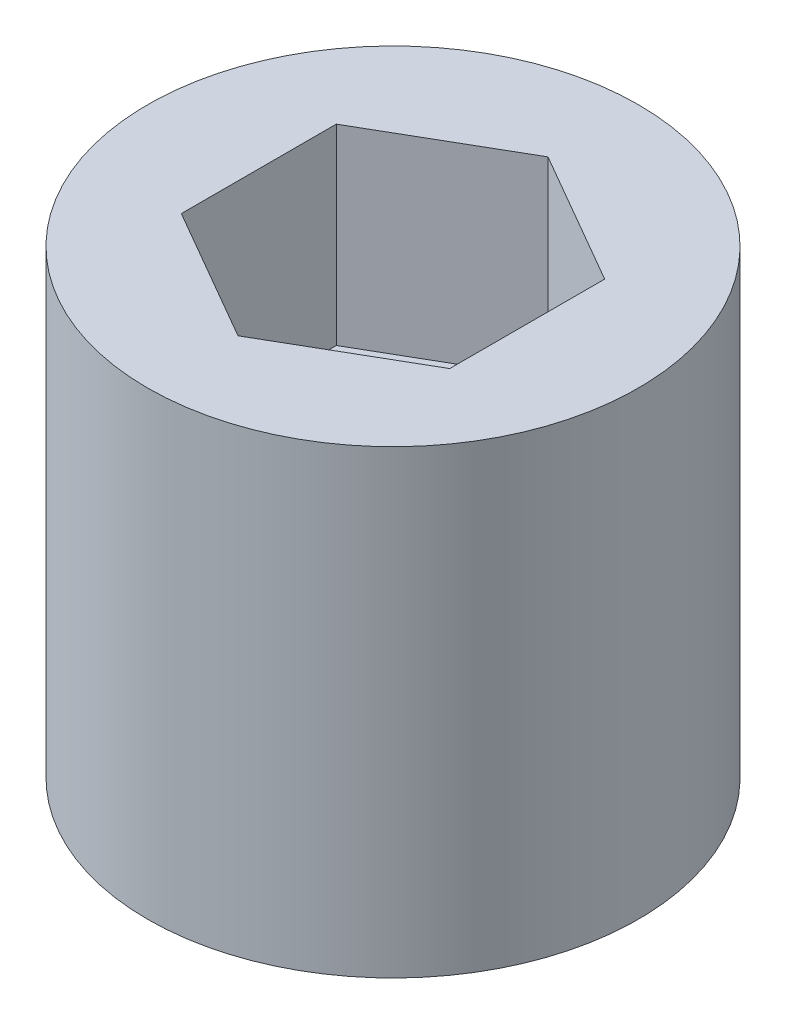
ISO-10303-21;
HEADER;
FILE_DESCRIPTION(('STEP AP214'),'2;1');
FILE_NAME('part.step','',(''),(''),'','','');
FILE_SCHEMA(('AUTOMOTIVE_DESIGN { 1 0 10303 214 1 1 1 1 }'));
ENDSEC;
DATA;
#1=APPLICATION_CONTEXT('core data for automotive mechanical design processes');
#2=APPLICATION_PROTOCOL_DEFINITION('international standard','automotive_design',2000,#1);
#3=PRODUCT_CONTEXT('',#1,'mechanical');
#4=PRODUCT('Part','Part','',(#3));
#5=PRODUCT_RELATED_PRODUCT_CATEGORY('part','',(#4));
#6=PRODUCT_DEFINITION_FORMATION('','',#4);
#7=PRODUCT_DEFINITION_CONTEXT('part definition',#1,'design');
#8=PRODUCT_DEFINITION('design','',#6,#7);
#9=PRODUCT_DEFINITION_SHAPE('','',#8);
#10=(LENGTH_UNIT() NAMED_UNIT(*) SI_UNIT(.MILLI.,.METRE.));
#11=(NAMED_UNIT(*) PLANE_ANGLE_UNIT() SI_UNIT($,.RADIAN.));
#12=(NAMED_UNIT(*) SI_UNIT($,.STERADIAN.) SOLID_ANGLE_UNIT());
#13=UNCERTAINTY_MEASURE_WITH_UNIT(LENGTH_MEASURE(1.E-05),#10,'distance_accuracy_value','');
#14=(GEOMETRIC_REPRESENTATION_CONTEXT(3) GLOBAL_UNCERTAINTY_ASSIGNED_CONTEXT((#13)) GLOBAL_UNIT_ASSIGNED_CONTEXT((#10,
#11,#12)) REPRESENTATION_CONTEXT('',''));
#15=CARTESIAN_POINT('',(0.,0.,0.));
#16=DIRECTION('',(0.,0.,1.));
#17=DIRECTION('',(1.,0.,0.));
#18=AXIS2_PLACEMENT_3D('',#15,#16,#17);
#19=CARTESIAN_POINT('',(0.,19.05,0.));
#20=DIRECTION('',(0.,-1.,0.));
#21=DIRECTION('',(0.,0.,-1.));
#22=AXIS2_PLACEMENT_3D('',#19,#20,#21);
#23=CYLINDRICAL_SURFACE('',#22,10.16);
#24=CARTESIAN_POINT('',(0.,19.05,0.));
#25=DIRECTION('',(0.,1.,0.));
#26=DIRECTION('',(0.,0.,1.));
#27=AXIS2_PLACEMENT_3D('',#24,#25,#26);
#28=CIRCLE('',#27,10.16);
#29=CARTESIAN_POINT('',(0.,19.05,-10.16));
#30=VERTEX_POINT('',#29);
#31=EDGE_CURVE('E11',#30,#30,#28,.T.);
#32=CARTESIAN_POINT('',(0.,0.,0.));
#33=DIRECTION('',(0.,1.,0.));
#34=DIRECTION('',(0.,0.,1.));
#35=AXIS2_PLACEMENT_3D('',#32,#33,#34);
#36=CIRCLE('',#35,10.16);
#37=CARTESIAN_POINT('',(0.,0.,-10.16));
#38=VERTEX_POINT('',#37);
#39=EDGE_CURVE('E36',#38,#38,#36,.T.);
#40=CARTESIAN_POINT('',(0.,19.05,-10.16));
#41=CARTESIAN_POINT('',(0.,18.8515625,-10.16));
#42=CARTESIAN_POINT('',(0.,18.653125,-10.16));
#43=CARTESIAN_POINT('',(0.,18.25625,-10.16));
#44=CARTESIAN_POINT('',(0.,18.0578125,-10.16));
#45=CARTESIAN_POINT('',(0.,17.6609375,-10.16));
#46=CARTESIAN_POINT('',(0.,17.4625,-10.16));
#47=CARTESIAN_POINT('',(0.,17.065625,-10.16));
#48=CARTESIAN_POINT('',(0.,16.8671875,-10.16));
#49=CARTESIAN_POINT('',(0.,16.4703125,-10.16));
#50=CARTESIAN_POINT('',(0.,16.271875,-10.16));
#51=CARTESIAN_POINT('',(0.,15.875,-10.16));
#52=CARTESIAN_POINT('',(0.,15.6765625,-10.16));
#53=CARTESIAN_POINT('',(0.,15.2796875,-10.16));
#54=CARTESIAN_POINT('',(0.,15.08125,-10.16));
#55=CARTESIAN_POINT('',(0.,14.684375,-10.16));
#56=CARTESIAN_POINT('',(0.,14.4859375,-10.16));
#57=CARTESIAN_POINT('',(0.,14.0890625,-10.16));
#58=CARTESIAN_POINT('',(0.,13.890625,-10.16));
#59=CARTESIAN_POINT('',(0.,13.49375,-10.16));
#60=CARTESIAN_POINT('',(0.,13.2953125,-10.16));
#61=CARTESIAN_POINT('',(0.,12.8984375,-10.16));
#62=CARTESIAN_POINT('',(0.,12.7,-10.16));
#63=CARTESIAN_POINT('',(0.,12.303125,-10.16));
#64=CARTESIAN_POINT('',(0.,12.1046875,-10.16));
#65=CARTESIAN_POINT('',(0.,11.7078125,-10.16));
#66=CARTESIAN_POINT('',(0.,11.509375,-10.16));
#67=CARTESIAN_POINT('',(0.,11.1125,-10.16));
#68=CARTESIAN_POINT('',(0.,10.9140625,-10.16));
#69=CARTESIAN_POINT('',(0.,10.5171875,-10.16));
#70=CARTESIAN_POINT('',(0.,10.31875,-10.16));
#71=CARTESIAN_POINT('',(0.,9.921875,-10.16));
#72=CARTESIAN_POINT('',(0.,9.7234375,-10.16));
#73=CARTESIAN_POINT('',(0.,9.3265625,-10.16));
#74=CARTESIAN_POINT('',(0.,9.128125,-10.16));
#75=CARTESIAN_POINT('',(0.,8.73125,-10.16));
#76=CARTESIAN_POINT('',(0.,8.5328125,-10.16));
#77=CARTESIAN_POINT('',(0.,8.1359375,-10.16));
#78=CARTESIAN_POINT('',(0.,7.9375,-10.16));
#79=CARTESIAN_POINT('',(0.,7.540625,-10.16));
#80=CARTESIAN_POINT('',(0.,7.3421875,-10.16));
#81=CARTESIAN_POINT('',(0.,6.9453125,-10.16));
#82=CARTESIAN_POINT('',(0.,6.746875,-10.16));
#83=CARTESIAN_POINT('',(0.,6.35,-10.16));
#84=CARTESIAN_POINT('',(0.,6.1515625,-10.16));
#85=CARTESIAN_POINT('',(0.,5.7546875,-10.16));
#86=CARTESIAN_POINT('',(0.,5.55625,-10.16));
#87=CARTESIAN_POINT('',(0.,5.159375,-10.16));
#88=CARTESIAN_POINT('',(0.,4.9609375,-10.16));
#89=CARTESIAN_POINT('',(0.,4.5640625,-10.16));
#90=CARTESIAN_POINT('',(0.,4.365625,-10.16));
#91=CARTESIAN_POINT('',(0.,3.96875,-10.16));
#92=CARTESIAN_POINT('',(0.,3.7703125,-10.16));
#93=CARTESIAN_POINT('',(0.,3.3734375,-10.16));
#94=CARTESIAN_POINT('',(0.,3.175,-10.16));
#95=CARTESIAN_POINT('',(0.,2.778125,-10.16));
#96=CARTESIAN_POINT('',(0.,2.5796875,-10.16));
#97=CARTESIAN_POINT('',(0.,2.1828125,-10.16));
#98=CARTESIAN_POINT('',(0.,1.984375,-10.16));
#99=CARTESIAN_POINT('',(0.,1.5875,-10.16));
#100=CARTESIAN_POINT('',(0.,1.3890625,-10.16));
#101=CARTESIAN_POINT('',(0.,0.992187500000001,-10.16));
#102=CARTESIAN_POINT('',(0.,0.793750000000001,-10.16));
#103=CARTESIAN_POINT('',(0.,0.396875,-10.16));
#104=CARTESIAN_POINT('',(0.,0.1984375,-10.16));
#105=CARTESIAN_POINT('',(0.,0.,-10.16));
#106=B_SPLINE_CURVE_WITH_KNOTS('',3,(#40,#41,#42,#43,#44,#45,#46,#47,#48,#49,#50,#51,#52,#53,
#54,#55,#56,#57,#58,#59,#60,#61,#62,#63,#64,#65,#66,#67,#68,#69,#70,#71,#72,#73,#74,#75,#76,#77,
#78,#79,#80,#81,#82,#83,#84,#85,#86,#87,#88,#89,#90,#91,#92,#93,#94,#95,#96,#97,#98,#99,#100,
#101,#102,#103,#104,#105),.UNSPECIFIED.,.F.,.F.,(4,2,2,2,2,2,2,2,2,2,2,2,2,2,2,2,2,2,2,2,2,2,2,
2,2,2,2,2,2,2,2,2,4),(0.,0.5953125,1.190625,1.7859375,2.38125,2.9765625,3.571875,4.1671875,
4.7625,5.3578125,5.953125,6.5484375,7.14375,7.7390625,8.334375,8.9296875,9.525,10.1203125,
10.715625,11.3109375,11.90625,12.5015625,13.096875,13.6921875,14.2875,14.8828125,15.478125,
16.0734375,16.66875,17.2640625,17.859375,18.4546875,19.05),.UNSPECIFIED.);
#107=EDGE_CURVE('BSEAM33',#30,#38,#106,.T.);
#108=ORIENTED_EDGE('',*,*,#31,.F.);
#109=ORIENTED_EDGE('',*,*,#39,.T.);
#110=ORIENTED_EDGE('',*,*,#107,.T.);
#111=ORIENTED_EDGE('',*,*,#107,.F.);
#112=EDGE_LOOP('',(#108,#110,#109,#111));
#113=FACE_BOUND('',#112,.T.);
#114=ADVANCED_FACE('F33',(#113),#23,.T.);
#115=CARTESIAN_POINT('',(0.,19.05,0.));
#116=DIRECTION('',(0.,1.,0.));
#117=DIRECTION('',(0.,0.,1.));
#118=AXIS2_PLACEMENT_3D('',#115,#116,#117);
#119=PLANE('',#118);
#120=DIRECTION('',(0.866025403784439,0.,0.5));
#121=VECTOR('',#120,1.);
#122=CARTESIAN_POINT('',(-5.55625000000005,19.05,3.20790243318489));
#123=LINE('',#122,#121);
#124=CARTESIAN_POINT('',(-5.55625000000005,19.05,3.20790243318489));
#125=VERTEX_POINT('',#124);
#126=CARTESIAN_POINT('',(0.,19.05,6.41580486636977));
#127=VERTEX_POINT('',#126);
#128=EDGE_CURVE('E140',#125,#127,#123,.T.);
#129=ORIENTED_EDGE('',*,*,#128,.F.);
#130=DIRECTION('',(0.,0.,1.));
#131=VECTOR('',#130,1.);
#132=CARTESIAN_POINT('',(-5.55625000000005,19.05,-3.20790243318489));
#133=LINE('',#132,#131);
#134=CARTESIAN_POINT('',(-5.55625000000005,19.05,-3.20790243318489));
#135=VERTEX_POINT('',#134);
#136=EDGE_CURVE('E148',#135,#125,#133,.T.);
#137=ORIENTED_EDGE('',*,*,#136,.F.);
#138=DIRECTION('',(-0.866025403784438,0.,0.5));
#139=VECTOR('',#138,1.);
#140=CARTESIAN_POINT('',(0.,19.05,-6.41580486636977));
#141=LINE('',#140,#139);
#142=CARTESIAN_POINT('',(0.,19.05,-6.41580486636977));
#143=VERTEX_POINT('',#142);
#144=EDGE_CURVE('E174',#143,#135,#141,.T.);
#145=ORIENTED_EDGE('',*,*,#144,.F.);
#146=DIRECTION('',(-0.866025403784439,0.,-0.5));
#147=VECTOR('',#146,1.);
#148=CARTESIAN_POINT('',(5.55625000000005,19.05,-3.20790243318489));
#149=LINE('',#148,#147);
#150=CARTESIAN_POINT('',(5.55625000000005,19.05,-3.20790243318489));
#151=VERTEX_POINT('',#150);
#152=EDGE_CURVE('E171',#151,#143,#149,.T.);
#153=ORIENTED_EDGE('',*,*,#152,.F.);
#154=DIRECTION('',(0.,0.,-1.));
#155=VECTOR('',#154,1.);
#156=CARTESIAN_POINT('',(5.55625000000005,19.05,3.20790243318489));
#157=LINE('',#156,#155);
#158=CARTESIAN_POINT('',(5.55625000000005,19.05,3.20790243318489));
#159=VERTEX_POINT('',#158);
#160=EDGE_CURVE('E168',#159,#151,#157,.T.);
#161=ORIENTED_EDGE('',*,*,#160,.F.);
#162=DIRECTION('',(0.866025403784439,0.,-0.5));
#163=VECTOR('',#162,1.);
#164=CARTESIAN_POINT('',(0.,19.05,6.41580486636977));
#165=LINE('',#164,#163);
#166=EDGE_CURVE('E165',#127,#159,#165,.T.);
#167=ORIENTED_EDGE('',*,*,#166,.F.);
#168=EDGE_LOOP('',(#129,#137,#145,#153,#161,#167));
#169=FACE_BOUND('',#168,.T.);
#170=ORIENTED_EDGE('',*,*,#31,.T.);
#171=EDGE_LOOP('',(#170));
#172=FACE_BOUND('',#171,.T.);
#173=ADVANCED_FACE('F199',(#169,#172),#119,.T.);
#174=CARTESIAN_POINT('',(0.,0.,0.));
#175=DIRECTION('',(0.,1.,0.));
#176=DIRECTION('',(0.,0.,1.));
#177=AXIS2_PLACEMENT_3D('',#174,#175,#176);
#178=PLANE('',#177);
#179=DIRECTION('',(0.,0.,-1.));
#180=VECTOR('',#179,1.);
#181=CARTESIAN_POINT('',(-1.524,0.,1.524));
#182=LINE('',#181,#180);
#183=CARTESIAN_POINT('',(-1.524,0.,1.524));
#184=VERTEX_POINT('',#183);
#185=CARTESIAN_POINT('',(-1.524,0.,-1.524));
#186=VERTEX_POINT('',#185);
#187=EDGE_CURVE('E134',#184,#186,#182,.T.);
#188=ORIENTED_EDGE('',*,*,#187,.F.);
#189=DIRECTION('',(-1.,0.,0.));
#190=VECTOR('',#189,1.);
#191=CARTESIAN_POINT('',(1.524,0.,1.524));
#192=LINE('',#191,#190);
#193=CARTESIAN_POINT('',(1.524,0.,1.524));
#194=VERTEX_POINT('',#193);
#195=EDGE_CURVE('E47',#194,#184,#192,.T.);
#196=ORIENTED_EDGE('',*,*,#195,.F.);
#197=DIRECTION('',(0.,0.,-1.));
#198=VECTOR('',#197,1.);
#199=CARTESIAN_POINT('',(1.524,0.,1.524));
#200=LINE('',#199,#198);
#201=CARTESIAN_POINT('',(1.524,0.,-1.524));
#202=VERTEX_POINT('',#201);
#203=EDGE_CURVE('E125',#194,#202,#200,.T.);
#204=ORIENTED_EDGE('',*,*,#203,.T.);
#205=DIRECTION('',(-1.,0.,0.));
#206=VECTOR('',#205,1.);
#207=CARTESIAN_POINT('',(1.524,0.,-1.524));
#208=LINE('',#207,#206);
#209=EDGE_CURVE('E128',#202,#186,#208,.T.);
#210=ORIENTED_EDGE('',*,*,#209,.T.);
#211=EDGE_LOOP('',(#188,#196,#204,#210));
#212=FACE_BOUND('',#211,.T.);
#213=ORIENTED_EDGE('',*,*,#39,.F.);
#214=EDGE_LOOP('',(#213));
#215=FACE_BOUND('',#214,.T.);
#216=ADVANCED_FACE('F230',(#212,#215),#178,.F.);
#217=CARTESIAN_POINT('',(-5.55625000000005,11.1125,3.20790243318489));
#218=DIRECTION('',(-0.5,0.,0.866025403784439));
#219=DIRECTION('',(0.866025403784439,0.,0.5));
#220=AXIS2_PLACEMENT_3D('',#217,#218,#219);
#221=PLANE('',#220);
#222=ORIENTED_EDGE('',*,*,#128,.T.);
#223=DIRECTION('',(0.,1.,0.));
#224=VECTOR('',#223,1.);
#225=CARTESIAN_POINT('',(0.,11.1125,6.41580486636977));
#226=LINE('',#225,#224);
#227=CARTESIAN_POINT('',(0.,11.1125,6.41580486636977));
#228=VERTEX_POINT('',#227);
#229=EDGE_CURVE('E163',#228,#127,#226,.T.);
#230=ORIENTED_EDGE('',*,*,#229,.F.);
#231=DIRECTION('',(0.866025403784439,0.,0.5));
#232=VECTOR('',#231,1.);
#233=CARTESIAN_POINT('',(-5.55625000000005,11.1125,3.20790243318489));
#234=LINE('',#233,#232);
#235=CARTESIAN_POINT('',(-5.55625000000005,11.1125,3.20790243318489));
#236=VERTEX_POINT('',#235);
#237=EDGE_CURVE('E144',#236,#228,#234,.T.);
#238=ORIENTED_EDGE('',*,*,#237,.F.);
#239=DIRECTION('',(0.,1.,0.));
#240=VECTOR('',#239,1.);
#241=CARTESIAN_POINT('',(-5.55625000000005,11.1125,3.20790243318489));
#242=LINE('',#241,#240);
#243=EDGE_CURVE('E179',#236,#125,#242,.T.);
#244=ORIENTED_EDGE('',*,*,#243,.T.);
#245=EDGE_LOOP('',(#222,#230,#238,#244));
#246=FACE_BOUND('',#245,.T.);
#247=ADVANCED_FACE('F209',(#246),#221,.F.);
#248=CARTESIAN_POINT('',(-5.55625000000005,11.1125,-3.20790243318489));
#249=DIRECTION('',(-1.,0.,0.));
#250=DIRECTION('',(0.,0.,1.));
#251=AXIS2_PLACEMENT_3D('',#248,#249,#250);
#252=PLANE('',#251);
#253=ORIENTED_EDGE('',*,*,#136,.T.);
#254=ORIENTED_EDGE('',*,*,#243,.F.);
#255=DIRECTION('',(0.,0.,1.));
#256=VECTOR('',#255,1.);
#257=CARTESIAN_POINT('',(-5.55625000000005,11.1125,-3.20790243318489));
#258=LINE('',#257,#256);
#259=CARTESIAN_POINT('',(-5.55625000000005,11.1125,-3.20790243318489));
#260=VERTEX_POINT('',#259);
#261=EDGE_CURVE('E160',#260,#236,#258,.T.);
#262=ORIENTED_EDGE('',*,*,#261,.F.);
#263=DIRECTION('',(0.,1.,0.));
#264=VECTOR('',#263,1.);
#265=CARTESIAN_POINT('',(-5.55625000000005,11.1125,-3.20790243318489));
#266=LINE('',#265,#264);
#267=EDGE_CURVE('E181',#260,#135,#266,.T.);
#268=ORIENTED_EDGE('',*,*,#267,.T.);
#269=EDGE_LOOP('',(#253,#254,#262,#268));
#270=FACE_BOUND('',#269,.T.);
#271=ADVANCED_FACE('F211',(#270),#252,.F.);
#272=CARTESIAN_POINT('',(0.,11.1125,-6.41580486636977));
#273=DIRECTION('',(-0.5,0.,-0.866025403784438));
#274=DIRECTION('',(-0.866025403784439,0.,0.5));
#275=AXIS2_PLACEMENT_3D('',#272,#273,#274);
#276=PLANE('',#275);
#277=ORIENTED_EDGE('',*,*,#144,.T.);
#278=ORIENTED_EDGE('',*,*,#267,.F.);
#279=DIRECTION('',(-0.866025403784438,0.,0.5));
#280=VECTOR('',#279,1.);
#281=CARTESIAN_POINT('',(0.,11.1125,-6.41580486636977));
#282=LINE('',#281,#280);
#283=CARTESIAN_POINT('',(0.,11.1125,-6.41580486636977));
#284=VERTEX_POINT('',#283);
#285=EDGE_CURVE('E157',#284,#260,#282,.T.);
#286=ORIENTED_EDGE('',*,*,#285,.F.);
#287=DIRECTION('',(0.,1.,0.));
#288=VECTOR('',#287,1.);
#289=CARTESIAN_POINT('',(0.,11.1125,-6.41580486636977));
#290=LINE('',#289,#288);
#291=EDGE_CURVE('E183',#284,#143,#290,.T.);
#292=ORIENTED_EDGE('',*,*,#291,.T.);
#293=EDGE_LOOP('',(#277,#278,#286,#292));
#294=FACE_BOUND('',#293,.T.);
#295=ADVANCED_FACE('F213',(#294),#276,.F.);
#296=CARTESIAN_POINT('',(5.55625000000005,11.1125,-3.20790243318489));
#297=DIRECTION('',(0.5,0.,-0.866025403784439));
#298=DIRECTION('',(-0.866025403784439,0.,-0.5));
#299=AXIS2_PLACEMENT_3D('',#296,#297,#298);
#300=PLANE('',#299);
#301=ORIENTED_EDGE('',*,*,#152,.T.);
#302=ORIENTED_EDGE('',*,*,#291,.F.);
#303=DIRECTION('',(-0.866025403784439,0.,-0.5));
#304=VECTOR('',#303,1.);
#305=CARTESIAN_POINT('',(5.55625000000005,11.1125,-3.20790243318489));
#306=LINE('',#305,#304);
#307=CARTESIAN_POINT('',(5.55625000000005,11.1125,-3.20790243318489));
#308=VERTEX_POINT('',#307);
#309=EDGE_CURVE('E154',#308,#284,#306,.T.);
#310=ORIENTED_EDGE('',*,*,#309,.F.);
#311=DIRECTION('',(0.,1.,0.));
#312=VECTOR('',#311,1.);
#313=CARTESIAN_POINT('',(5.55625000000005,11.1125,-3.20790243318489));
#314=LINE('',#313,#312);
#315=EDGE_CURVE('E185',#308,#151,#314,.T.);
#316=ORIENTED_EDGE('',*,*,#315,.T.);
#317=EDGE_LOOP('',(#301,#302,#310,#316));
#318=FACE_BOUND('',#317,.T.);
#319=ADVANCED_FACE('F216',(#318),#300,.F.);
#320=CARTESIAN_POINT('',(5.55625000000005,11.1125,3.20790243318489));
#321=DIRECTION('',(1.,0.,0.));
#322=DIRECTION('',(0.,0.,-1.));
#323=AXIS2_PLACEMENT_3D('',#320,#321,#322);
#324=PLANE('',#323);
#325=ORIENTED_EDGE('',*,*,#160,.T.);
#326=ORIENTED_EDGE('',*,*,#315,.F.);
#327=DIRECTION('',(0.,0.,-1.));
#328=VECTOR('',#327,1.);
#329=CARTESIAN_POINT('',(5.55625000000005,11.1125,3.20790243318489));
#330=LINE('',#329,#328);
#331=CARTESIAN_POINT('',(5.55625000000005,11.1125,3.20790243318489));
#332=VERTEX_POINT('',#331);
#333=EDGE_CURVE('E151',#332,#308,#330,.T.);
#334=ORIENTED_EDGE('',*,*,#333,.F.);
#335=DIRECTION('',(0.,1.,0.));
#336=VECTOR('',#335,1.);
#337=CARTESIAN_POINT('',(5.55625000000005,11.1125,3.20790243318489));
#338=LINE('',#337,#336);
#339=EDGE_CURVE('E187',#332,#159,#338,.T.);
#340=ORIENTED_EDGE('',*,*,#339,.T.);
#341=EDGE_LOOP('',(#325,#326,#334,#340));
#342=FACE_BOUND('',#341,.T.);
#343=ADVANCED_FACE('F205',(#342),#324,.F.);
#344=CARTESIAN_POINT('',(0.,11.1125,6.41580486636977));
#345=DIRECTION('',(0.5,0.,0.866025403784439));
#346=DIRECTION('',(0.866025403784439,0.,-0.5));
#347=AXIS2_PLACEMENT_3D('',#344,#345,#346);
#348=PLANE('',#347);
#349=ORIENTED_EDGE('',*,*,#166,.T.);
#350=ORIENTED_EDGE('',*,*,#339,.F.);
#351=DIRECTION('',(0.866025403784439,0.,-0.5));
#352=VECTOR('',#351,1.);
#353=CARTESIAN_POINT('',(0.,11.1125,6.41580486636977));
#354=LINE('',#353,#352);
#355=EDGE_CURVE('E147',#228,#332,#354,.T.);
#356=ORIENTED_EDGE('',*,*,#355,.F.);
#357=ORIENTED_EDGE('',*,*,#229,.T.);
#358=EDGE_LOOP('',(#349,#350,#356,#357));
#359=FACE_BOUND('',#358,.T.);
#360=ADVANCED_FACE('F193',(#359),#348,.F.);
#361=CARTESIAN_POINT('',(0.,11.1125,0.));
#362=DIRECTION('',(0.,1.,0.));
#363=DIRECTION('',(0.,0.,1.));
#364=AXIS2_PLACEMENT_3D('',#361,#362,#363);
#365=PLANE('',#364);
#366=DIRECTION('',(-1.,0.,0.));
#367=VECTOR('',#366,1.);
#368=CARTESIAN_POINT('',(1.524,11.1125,1.524));
#369=LINE('',#368,#367);
#370=CARTESIAN_POINT('',(1.524,11.1125,1.524));
#371=VERTEX_POINT('',#370);
#372=CARTESIAN_POINT('',(-1.524,11.1125,1.524));
#373=VERTEX_POINT('',#372);
#374=EDGE_CURVE('E111',#371,#373,#369,.T.);
#375=ORIENTED_EDGE('',*,*,#374,.T.);
#376=DIRECTION('',(0.,0.,-1.));
#377=VECTOR('',#376,1.);
#378=CARTESIAN_POINT('',(-1.524,11.1125,1.524));
#379=LINE('',#378,#377);
#380=CARTESIAN_POINT('',(-1.524,11.1125,-1.524));
#381=VERTEX_POINT('',#380);
#382=EDGE_CURVE('E117',#373,#381,#379,.T.);
#383=ORIENTED_EDGE('',*,*,#382,.T.);
#384=DIRECTION('',(-1.,0.,0.));
#385=VECTOR('',#384,1.);
#386=CARTESIAN_POINT('',(1.524,11.1125,-1.524));
#387=LINE('',#386,#385);
#388=CARTESIAN_POINT('',(1.524,11.1125,-1.524));
#389=VERTEX_POINT('',#388);
#390=EDGE_CURVE('E121',#389,#381,#387,.T.);
#391=ORIENTED_EDGE('',*,*,#390,.F.);
#392=DIRECTION('',(0.,0.,-1.));
#393=VECTOR('',#392,1.);
#394=CARTESIAN_POINT('',(1.524,11.1125,1.524));
#395=LINE('',#394,#393);
#396=EDGE_CURVE('E114',#371,#389,#395,.T.);
#397=ORIENTED_EDGE('',*,*,#396,.F.);
#398=EDGE_LOOP('',(#375,#383,#391,#397));
#399=FACE_BOUND('',#398,.T.);
#400=ORIENTED_EDGE('',*,*,#237,.T.);
#401=ORIENTED_EDGE('',*,*,#355,.T.);
#402=ORIENTED_EDGE('',*,*,#333,.T.);
#403=ORIENTED_EDGE('',*,*,#309,.T.);
#404=ORIENTED_EDGE('',*,*,#285,.T.);
#405=ORIENTED_EDGE('',*,*,#261,.T.);
#406=EDGE_LOOP('',(#400,#401,#402,#403,#404,#405));
#407=FACE_BOUND('',#406,.T.);
#408=ADVANCED_FACE('F123',(#399,#407),#365,.T.);
#409=CARTESIAN_POINT('',(1.524,11.1125,1.524));
#410=DIRECTION('',(0.,0.,1.));
#411=DIRECTION('',(1.,0.,0.));
#412=AXIS2_PLACEMENT_3D('',#409,#410,#411);
#413=PLANE('',#412);
#414=ORIENTED_EDGE('',*,*,#195,.T.);
#415=DIRECTION('',(0.,-1.,0.));
#416=VECTOR('',#415,1.);
#417=CARTESIAN_POINT('',(-1.524,11.1125,1.524));
#418=LINE('',#417,#416);
#419=EDGE_CURVE('E108',#373,#184,#418,.T.);
#420=ORIENTED_EDGE('',*,*,#419,.F.);
#421=ORIENTED_EDGE('',*,*,#374,.F.);
#422=DIRECTION('',(0.,-1.,0.));
#423=VECTOR('',#422,1.);
#424=CARTESIAN_POINT('',(1.524,11.1125,1.524));
#425=LINE('',#424,#423);
#426=EDGE_CURVE('E138',#371,#194,#425,.T.);
#427=ORIENTED_EDGE('',*,*,#426,.T.);
#428=EDGE_LOOP('',(#414,#420,#421,#427));
#429=FACE_BOUND('',#428,.T.);
#430=ADVANCED_FACE('F109',(#429),#413,.F.);
#431=CARTESIAN_POINT('',(1.524,11.1125,1.524));
#432=DIRECTION('',(-1.,0.,0.));
#433=DIRECTION('',(0.,0.,1.));
#434=AXIS2_PLACEMENT_3D('',#431,#432,#433);
#435=PLANE('',#434);
#436=ORIENTED_EDGE('',*,*,#203,.F.);
#437=ORIENTED_EDGE('',*,*,#426,.F.);
#438=ORIENTED_EDGE('',*,*,#396,.T.);
#439=DIRECTION('',(0.,-1.,0.));
#440=VECTOR('',#439,1.);
#441=CARTESIAN_POINT('',(1.524,11.1125,-1.524));
#442=LINE('',#441,#440);
#443=EDGE_CURVE('E141',#389,#202,#442,.T.);
#444=ORIENTED_EDGE('',*,*,#443,.T.);
#445=EDGE_LOOP('',(#436,#437,#438,#444));
#446=FACE_BOUND('',#445,.T.);
#447=ADVANCED_FACE('F252',(#446),#435,.T.);
#448=CARTESIAN_POINT('',(1.524,11.1125,-1.524));
#449=DIRECTION('',(0.,0.,1.));
#450=DIRECTION('',(1.,0.,0.));
#451=AXIS2_PLACEMENT_3D('',#448,#449,#450);
#452=PLANE('',#451);
#453=ORIENTED_EDGE('',*,*,#209,.F.);
#454=ORIENTED_EDGE('',*,*,#443,.F.);
#455=ORIENTED_EDGE('',*,*,#390,.T.);
#456=DIRECTION('',(0.,-1.,0.));
#457=VECTOR('',#456,1.);
#458=CARTESIAN_POINT('',(-1.524,11.1125,-1.524));
#459=LINE('',#458,#457);
#460=EDGE_CURVE('E55',#381,#186,#459,.T.);
#461=ORIENTED_EDGE('',*,*,#460,.T.);
#462=EDGE_LOOP('',(#453,#454,#455,#461));
#463=FACE_BOUND('',#462,.T.);
#464=ADVANCED_FACE('F304',(#463),#452,.T.);
#465=CARTESIAN_POINT('',(-1.524,11.1125,1.524));
#466=DIRECTION('',(-1.,0.,0.));
#467=DIRECTION('',(0.,0.,1.));
#468=AXIS2_PLACEMENT_3D('',#465,#466,#467);
#469=PLANE('',#468);
#470=ORIENTED_EDGE('',*,*,#187,.T.);
#471=ORIENTED_EDGE('',*,*,#460,.F.);
#472=ORIENTED_EDGE('',*,*,#382,.F.);
#473=ORIENTED_EDGE('',*,*,#419,.T.);
#474=EDGE_LOOP('',(#470,#471,#472,#473));
#475=FACE_BOUND('',#474,.T.);
#476=ADVANCED_FACE('F118',(#475),#469,.F.);
#477=CLOSED_SHELL('',(#114,#173,#216,#247,#271,#295,#319,#343,#360,#408,#430,#447,#464,#476));
#478=MANIFOLD_SOLID_BREP('B2',#477);
#479=ADVANCED_BREP_SHAPE_REPRESENTATION('',(#18,#478),#14);
#480=SHAPE_DEFINITION_REPRESENTATION(#9,#479);
ENDSEC;
END-ISO-10303-21;
